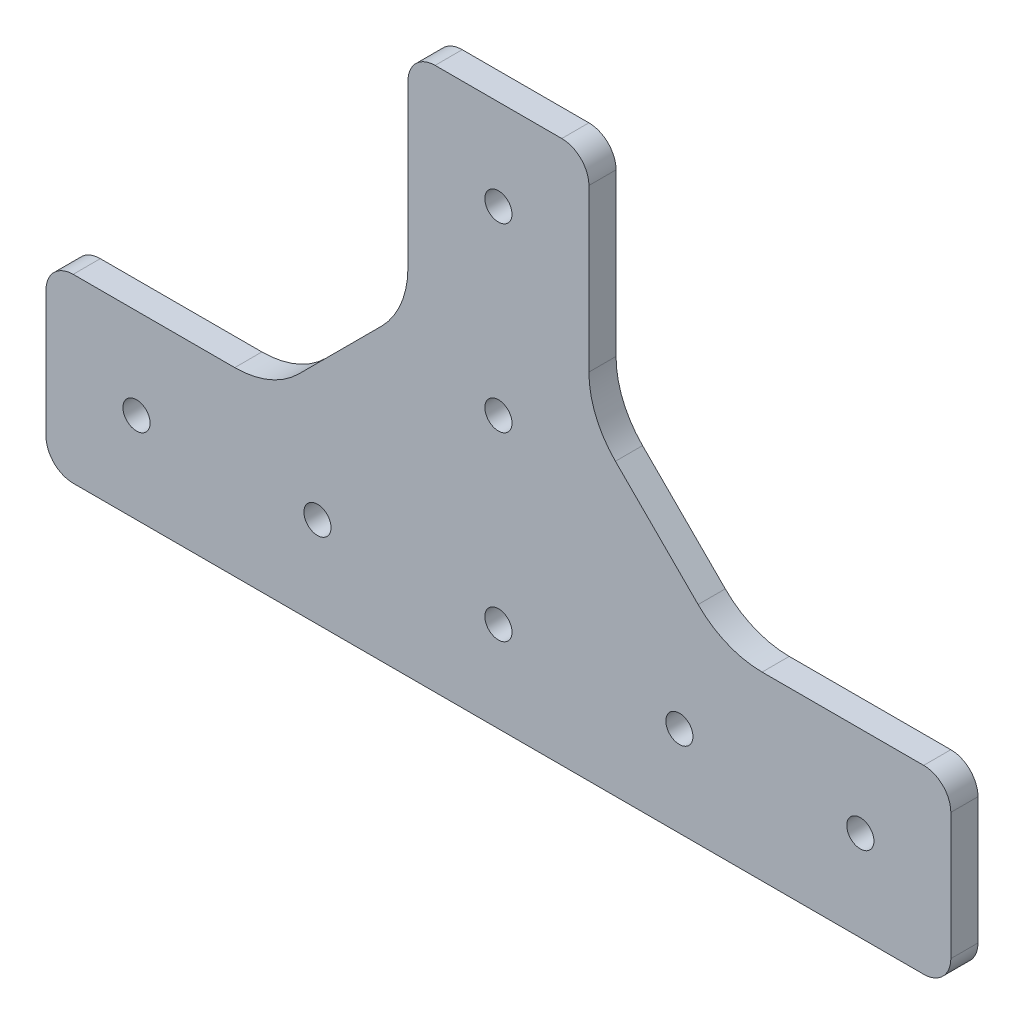
ISO-10303-21;
HEADER;
FILE_DESCRIPTION(('STEP AP214'),'2;1');
FILE_NAME('part.step','',(''),(''),'','','');
FILE_SCHEMA(('AUTOMOTIVE_DESIGN { 1 0 10303 214 1 1 1 1 }'));
ENDSEC;
DATA;
#1=APPLICATION_CONTEXT('core data for automotive mechanical design processes');
#2=APPLICATION_PROTOCOL_DEFINITION('international standard','automotive_design',2000,#1);
#3=PRODUCT_CONTEXT('',#1,'mechanical');
#4=PRODUCT('Part','Part','',(#3));
#5=PRODUCT_RELATED_PRODUCT_CATEGORY('part','',(#4));
#6=PRODUCT_DEFINITION_FORMATION('','',#4);
#7=PRODUCT_DEFINITION_CONTEXT('part definition',#1,'design');
#8=PRODUCT_DEFINITION('design','',#6,#7);
#9=PRODUCT_DEFINITION_SHAPE('','',#8);
#10=(LENGTH_UNIT() NAMED_UNIT(*) SI_UNIT(.MILLI.,.METRE.));
#11=(NAMED_UNIT(*) PLANE_ANGLE_UNIT() SI_UNIT($,.RADIAN.));
#12=(NAMED_UNIT(*) SI_UNIT($,.STERADIAN.) SOLID_ANGLE_UNIT());
#13=UNCERTAINTY_MEASURE_WITH_UNIT(LENGTH_MEASURE(1.E-05),#10,'distance_accuracy_value','');
#14=(GEOMETRIC_REPRESENTATION_CONTEXT(3) GLOBAL_UNCERTAINTY_ASSIGNED_CONTEXT((#13)) GLOBAL_UNIT_ASSIGNED_CONTEXT((#10,
#11,#12)) REPRESENTATION_CONTEXT('',''));
#15=CARTESIAN_POINT('',(0.,0.,0.));
#16=DIRECTION('',(0.,0.,1.));
#17=DIRECTION('',(1.,0.,0.));
#18=AXIS2_PLACEMENT_3D('',#15,#16,#17);
#19=CARTESIAN_POINT('',(0.,0.,3.));
#20=DIRECTION('',(1.,0.,0.));
#21=DIRECTION('',(0.,0.,-1.));
#22=AXIS2_PLACEMENT_3D('',#19,#20,#21);
#23=PLANE('',#22);
#24=DIRECTION('',(0.,-1.,0.));
#25=VECTOR('',#24,1.);
#26=CARTESIAN_POINT('',(0.,0.,0.));
#27=LINE('',#26,#25);
#28=CARTESIAN_POINT('',(0.,57.,0.));
#29=VERTEX_POINT('',#28);
#30=CARTESIAN_POINT('',(0.,39.1421356237311,0.));
#31=VERTEX_POINT('',#30);
#32=EDGE_CURVE('E313',#29,#31,#27,.T.);
#33=ORIENTED_EDGE('',*,*,#32,.T.);
#34=DIRECTION('',(0.,0.,1.));
#35=VECTOR('',#34,1.);
#36=CARTESIAN_POINT('',(0.,39.1421356237311,3.));
#37=LINE('',#36,#35);
#38=CARTESIAN_POINT('',(0.,39.1421356237311,3.));
#39=VERTEX_POINT('',#38);
#40=EDGE_CURVE('E288',#31,#39,#37,.T.);
#41=ORIENTED_EDGE('',*,*,#40,.T.);
#42=DIRECTION('',(0.,-1.,0.));
#43=VECTOR('',#42,1.);
#44=CARTESIAN_POINT('',(0.,0.,3.));
#45=LINE('',#44,#43);
#46=CARTESIAN_POINT('',(0.,57.,3.));
#47=VERTEX_POINT('',#46);
#48=EDGE_CURVE('E204',#47,#39,#45,.T.);
#49=ORIENTED_EDGE('',*,*,#48,.F.);
#50=DIRECTION('',(0.,0.,-1.));
#51=VECTOR('',#50,1.);
#52=CARTESIAN_POINT('',(0.,57.,3.));
#53=LINE('',#52,#51);
#54=EDGE_CURVE('E257',#47,#29,#53,.T.);
#55=ORIENTED_EDGE('',*,*,#54,.T.);
#56=EDGE_LOOP('',(#33,#41,#49,#55));
#57=FACE_BOUND('',#56,.T.);
#58=ADVANCED_FACE('F43',(#57),#23,.F.);
#59=CARTESIAN_POINT('',(0.,0.,3.));
#60=DIRECTION('',(0.,1.,0.));
#61=DIRECTION('',(0.,0.,1.));
#62=AXIS2_PLACEMENT_3D('',#59,#60,#61);
#63=PLANE('',#62);
#64=DIRECTION('',(1.,0.,0.));
#65=VECTOR('',#64,1.);
#66=CARTESIAN_POINT('',(0.,0.,0.));
#67=LINE('',#66,#65);
#68=CARTESIAN_POINT('',(-37.,0.,0.));
#69=VERTEX_POINT('',#68);
#70=CARTESIAN_POINT('',(57.,0.,0.));
#71=VERTEX_POINT('',#70);
#72=EDGE_CURVE('E210',#69,#71,#67,.T.);
#73=ORIENTED_EDGE('',*,*,#72,.T.);
#74=DIRECTION('',(0.,0.,1.));
#75=VECTOR('',#74,1.);
#76=CARTESIAN_POINT('',(57.,0.,3.));
#77=LINE('',#76,#75);
#78=CARTESIAN_POINT('',(57.,0.,3.));
#79=VERTEX_POINT('',#78);
#80=EDGE_CURVE('E246',#71,#79,#77,.T.);
#81=ORIENTED_EDGE('',*,*,#80,.T.);
#82=DIRECTION('',(1.,0.,0.));
#83=VECTOR('',#82,1.);
#84=CARTESIAN_POINT('',(0.,0.,3.));
#85=LINE('',#84,#83);
#86=CARTESIAN_POINT('',(-37.,0.,3.));
#87=VERTEX_POINT('',#86);
#88=EDGE_CURVE('E208',#87,#79,#85,.T.);
#89=ORIENTED_EDGE('',*,*,#88,.F.);
#90=DIRECTION('',(0.,0.,1.));
#91=VECTOR('',#90,1.);
#92=CARTESIAN_POINT('',(-37.,0.,0.));
#93=LINE('',#92,#91);
#94=EDGE_CURVE('E244',#87,#69,#93,.F.);
#95=ORIENTED_EDGE('',*,*,#94,.T.);
#96=EDGE_LOOP('',(#73,#81,#89,#95));
#97=FACE_BOUND('',#96,.T.);
#98=ADVANCED_FACE('F412',(#97),#63,.F.);
#99=CARTESIAN_POINT('',(20.,0.,3.));
#100=DIRECTION('',(-1.,0.,0.));
#101=DIRECTION('',(0.,0.,1.));
#102=AXIS2_PLACEMENT_3D('',#99,#100,#101);
#103=PLANE('',#102);
#104=DIRECTION('',(0.,1.,0.));
#105=VECTOR('',#104,1.);
#106=CARTESIAN_POINT('',(20.,0.,3.));
#107=LINE('',#106,#105);
#108=CARTESIAN_POINT('',(20.,39.142135623731,3.));
#109=VERTEX_POINT('',#108);
#110=CARTESIAN_POINT('',(20.,57.,3.));
#111=VERTEX_POINT('',#110);
#112=EDGE_CURVE('E322',#109,#111,#107,.T.);
#113=ORIENTED_EDGE('',*,*,#112,.F.);
#114=DIRECTION('',(0.,0.,-1.));
#115=VECTOR('',#114,1.);
#116=CARTESIAN_POINT('',(20.,39.142135623731,0.));
#117=LINE('',#116,#115);
#118=CARTESIAN_POINT('',(20.,39.142135623731,0.));
#119=VERTEX_POINT('',#118);
#120=EDGE_CURVE('E278',#109,#119,#117,.T.);
#121=ORIENTED_EDGE('',*,*,#120,.T.);
#122=DIRECTION('',(0.,1.,0.));
#123=VECTOR('',#122,1.);
#124=CARTESIAN_POINT('',(20.,0.,0.));
#125=LINE('',#124,#123);
#126=CARTESIAN_POINT('',(20.,57.,0.));
#127=VERTEX_POINT('',#126);
#128=EDGE_CURVE('E205',#119,#127,#125,.T.);
#129=ORIENTED_EDGE('',*,*,#128,.T.);
#130=DIRECTION('',(0.,0.,-1.));
#131=VECTOR('',#130,1.);
#132=CARTESIAN_POINT('',(20.,57.,3.));
#133=LINE('',#132,#131);
#134=EDGE_CURVE('E187',#127,#111,#133,.F.);
#135=ORIENTED_EDGE('',*,*,#134,.T.);
#136=EDGE_LOOP('',(#113,#121,#129,#135));
#137=FACE_BOUND('',#136,.T.);
#138=ADVANCED_FACE('F419',(#137),#103,.F.);
#139=CARTESIAN_POINT('',(0.,60.,3.));
#140=DIRECTION('',(0.,-1.,0.));
#141=DIRECTION('',(0.,0.,-1.));
#142=AXIS2_PLACEMENT_3D('',#139,#140,#141);
#143=PLANE('',#142);
#144=DIRECTION('',(-1.,0.,0.));
#145=VECTOR('',#144,1.);
#146=CARTESIAN_POINT('',(0.,60.,3.));
#147=LINE('',#146,#145);
#148=CARTESIAN_POINT('',(17.,60.,3.));
#149=VERTEX_POINT('',#148);
#150=CARTESIAN_POINT('',(3.,60.,3.));
#151=VERTEX_POINT('',#150);
#152=EDGE_CURVE('E199',#149,#151,#147,.T.);
#153=ORIENTED_EDGE('',*,*,#152,.F.);
#154=DIRECTION('',(0.,0.,-1.));
#155=VECTOR('',#154,1.);
#156=CARTESIAN_POINT('',(17.,60.,3.));
#157=LINE('',#156,#155);
#158=CARTESIAN_POINT('',(17.,60.,0.));
#159=VERTEX_POINT('',#158);
#160=EDGE_CURVE('E185',#149,#159,#157,.T.);
#161=ORIENTED_EDGE('',*,*,#160,.T.);
#162=DIRECTION('',(-1.,0.,0.));
#163=VECTOR('',#162,1.);
#164=CARTESIAN_POINT('',(0.,60.,0.));
#165=LINE('',#164,#163);
#166=CARTESIAN_POINT('',(3.,60.,0.));
#167=VERTEX_POINT('',#166);
#168=EDGE_CURVE('E196',#159,#167,#165,.T.);
#169=ORIENTED_EDGE('',*,*,#168,.T.);
#170=DIRECTION('',(0.,0.,-1.));
#171=VECTOR('',#170,1.);
#172=CARTESIAN_POINT('',(3.,60.,3.));
#173=LINE('',#172,#171);
#174=EDGE_CURVE('E201',#167,#151,#173,.F.);
#175=ORIENTED_EDGE('',*,*,#174,.T.);
#176=EDGE_LOOP('',(#153,#161,#169,#175));
#177=FACE_BOUND('',#176,.T.);
#178=ADVANCED_FACE('F195',(#177),#143,.F.);
#179=CARTESIAN_POINT('',(0.,0.,3.));
#180=DIRECTION('',(0.,0.,-1.));
#181=DIRECTION('',(-1.,0.,0.));
#182=AXIS2_PLACEMENT_3D('',#179,#180,#181);
#183=PLANE('',#182);
#184=CARTESIAN_POINT('',(50.,10.,3.));
#185=DIRECTION('',(0.,0.,1.));
#186=DIRECTION('',(1.,0.,0.));
#187=AXIS2_PLACEMENT_3D('',#184,#185,#186);
#188=CIRCLE('',#187,1.5);
#189=CARTESIAN_POINT('',(51.5,10.,3.));
#190=VERTEX_POINT('',#189);
#191=EDGE_CURVE('E353',#190,#190,#188,.T.);
#192=ORIENTED_EDGE('',*,*,#191,.F.);
#193=EDGE_LOOP('',(#192));
#194=FACE_BOUND('',#193,.T.);
#195=CARTESIAN_POINT('',(30.,10.,3.));
#196=DIRECTION('',(0.,0.,1.));
#197=DIRECTION('',(1.,0.,0.));
#198=AXIS2_PLACEMENT_3D('',#195,#196,#197);
#199=CIRCLE('',#198,1.50000000000001);
#200=CARTESIAN_POINT('',(31.5,10.,3.));
#201=VERTEX_POINT('',#200);
#202=EDGE_CURVE('E359',#201,#201,#199,.T.);
#203=ORIENTED_EDGE('',*,*,#202,.F.);
#204=EDGE_LOOP('',(#203));
#205=FACE_BOUND('',#204,.T.);
#206=CARTESIAN_POINT('',(-10.,10.,3.));
#207=DIRECTION('',(0.,0.,1.));
#208=DIRECTION('',(1.,0.,0.));
#209=AXIS2_PLACEMENT_3D('',#206,#207,#208);
#210=CIRCLE('',#209,1.5);
#211=CARTESIAN_POINT('',(-8.5,10.,3.));
#212=VERTEX_POINT('',#211);
#213=EDGE_CURVE('E365',#212,#212,#210,.T.);
#214=ORIENTED_EDGE('',*,*,#213,.F.);
#215=EDGE_LOOP('',(#214));
#216=FACE_BOUND('',#215,.T.);
#217=CARTESIAN_POINT('',(-30.,10.,3.));
#218=DIRECTION('',(0.,0.,1.));
#219=DIRECTION('',(1.,0.,0.));
#220=AXIS2_PLACEMENT_3D('',#217,#218,#219);
#221=CIRCLE('',#220,1.5);
#222=CARTESIAN_POINT('',(-28.5,10.,3.));
#223=VERTEX_POINT('',#222);
#224=EDGE_CURVE('E371',#223,#223,#221,.T.);
#225=ORIENTED_EDGE('',*,*,#224,.F.);
#226=EDGE_LOOP('',(#225));
#227=FACE_BOUND('',#226,.T.);
#228=CARTESIAN_POINT('',(10.,50.,3.));
#229=DIRECTION('',(0.,0.,1.));
#230=DIRECTION('',(1.,0.,0.));
#231=AXIS2_PLACEMENT_3D('',#228,#229,#230);
#232=CIRCLE('',#231,1.5);
#233=CARTESIAN_POINT('',(11.5,50.,3.));
#234=VERTEX_POINT('',#233);
#235=EDGE_CURVE('E377',#234,#234,#232,.T.);
#236=ORIENTED_EDGE('',*,*,#235,.F.);
#237=EDGE_LOOP('',(#236));
#238=FACE_BOUND('',#237,.T.);
#239=CARTESIAN_POINT('',(10.,30.,3.));
#240=DIRECTION('',(0.,0.,1.));
#241=DIRECTION('',(1.,0.,0.));
#242=AXIS2_PLACEMENT_3D('',#239,#240,#241);
#243=CIRCLE('',#242,1.5);
#244=CARTESIAN_POINT('',(11.5,30.,3.));
#245=VERTEX_POINT('',#244);
#246=EDGE_CURVE('E347',#245,#245,#243,.T.);
#247=ORIENTED_EDGE('',*,*,#246,.F.);
#248=EDGE_LOOP('',(#247));
#249=FACE_BOUND('',#248,.T.);
#250=CARTESIAN_POINT('',(10.,10.,3.));
#251=DIRECTION('',(0.,0.,1.));
#252=DIRECTION('',(1.,0.,0.));
#253=AXIS2_PLACEMENT_3D('',#250,#251,#252);
#254=CIRCLE('',#253,1.5);
#255=CARTESIAN_POINT('',(11.5,10.,3.));
#256=VERTEX_POINT('',#255);
#257=EDGE_CURVE('E344',#256,#256,#254,.T.);
#258=ORIENTED_EDGE('',*,*,#257,.F.);
#259=EDGE_LOOP('',(#258));
#260=FACE_BOUND('',#259,.T.);
#261=DIRECTION('',(-1.,0.,0.));
#262=VECTOR('',#261,1.);
#263=CARTESIAN_POINT('',(0.,20.,3.));
#264=LINE('',#263,#262);
#265=CARTESIAN_POINT('',(57.,20.,3.));
#266=VERTEX_POINT('',#265);
#267=CARTESIAN_POINT('',(39.1421356237309,20.,3.));
#268=VERTEX_POINT('',#267);
#269=EDGE_CURVE('E326',#266,#268,#264,.T.);
#270=ORIENTED_EDGE('',*,*,#269,.T.);
#271=CARTESIAN_POINT('',(39.1421356237309,30.,3.));
#272=DIRECTION('',(0.,0.,-1.));
#273=DIRECTION('',(-1.,0.,0.));
#274=AXIS2_PLACEMENT_3D('',#271,#272,#273);
#275=CIRCLE('',#274,10.);
#276=CARTESIAN_POINT('',(32.0710678118654,22.9289321881346,3.));
#277=VERTEX_POINT('',#276);
#278=EDGE_CURVE('E290',#268,#277,#275,.T.);
#279=ORIENTED_EDGE('',*,*,#278,.T.);
#280=DIRECTION('',(-0.707106781186544,0.707106781186551,0.));
#281=VECTOR('',#280,1.);
#282=CARTESIAN_POINT('',(27.5000000000002,27.4999999999999,3.));
#283=LINE('',#282,#281);
#284=CARTESIAN_POINT('',(22.9289321881345,32.0710678118656,3.));
#285=VERTEX_POINT('',#284);
#286=EDGE_CURVE('E263',#277,#285,#283,.T.);
#287=ORIENTED_EDGE('',*,*,#286,.T.);
#288=CARTESIAN_POINT('',(30.,39.142135623731,3.));
#289=DIRECTION('',(0.,0.,-1.));
#290=DIRECTION('',(-1.,0.,0.));
#291=AXIS2_PLACEMENT_3D('',#288,#289,#290);
#292=CIRCLE('',#291,10.);
#293=EDGE_CURVE('E296',#285,#109,#292,.T.);
#294=ORIENTED_EDGE('',*,*,#293,.T.);
#295=ORIENTED_EDGE('',*,*,#112,.T.);
#296=CARTESIAN_POINT('',(17.,57.,3.));
#297=DIRECTION('',(0.,0.,-1.));
#298=DIRECTION('',(-1.,0.,0.));
#299=AXIS2_PLACEMENT_3D('',#296,#297,#298);
#300=CIRCLE('',#299,3.);
#301=EDGE_CURVE('E235',#111,#149,#300,.F.);
#302=ORIENTED_EDGE('',*,*,#301,.T.);
#303=ORIENTED_EDGE('',*,*,#152,.T.);
#304=CARTESIAN_POINT('',(3.,57.,3.));
#305=DIRECTION('',(0.,0.,-1.));
#306=DIRECTION('',(-1.,0.,0.));
#307=AXIS2_PLACEMENT_3D('',#304,#305,#306);
#308=CIRCLE('',#307,3.);
#309=EDGE_CURVE('E225',#151,#47,#308,.F.);
#310=ORIENTED_EDGE('',*,*,#309,.T.);
#311=ORIENTED_EDGE('',*,*,#48,.T.);
#312=CARTESIAN_POINT('',(-10.,39.1421356237311,3.));
#313=DIRECTION('',(0.,0.,-1.));
#314=DIRECTION('',(-1.,0.,0.));
#315=AXIS2_PLACEMENT_3D('',#312,#313,#314);
#316=CIRCLE('',#315,10.);
#317=CARTESIAN_POINT('',(-2.92893218813448,32.0710678118656,3.));
#318=VERTEX_POINT('',#317);
#319=EDGE_CURVE('E51',#39,#318,#316,.T.);
#320=ORIENTED_EDGE('',*,*,#319,.T.);
#321=DIRECTION('',(-0.707106781186543,-0.707106781186552,0.));
#322=VECTOR('',#321,1.);
#323=CARTESIAN_POINT('',(-17.5000000000001,17.4999999999999,3.));
#324=LINE('',#323,#322);
#325=CARTESIAN_POINT('',(-12.0710678118654,22.9289321881346,3.));
#326=VERTEX_POINT('',#325);
#327=EDGE_CURVE('E266',#318,#326,#324,.T.);
#328=ORIENTED_EDGE('',*,*,#327,.T.);
#329=CARTESIAN_POINT('',(-19.1421356237309,30.,3.));
#330=DIRECTION('',(0.,0.,-1.));
#331=DIRECTION('',(-1.,0.,0.));
#332=AXIS2_PLACEMENT_3D('',#329,#330,#331);
#333=CIRCLE('',#332,10.);
#334=CARTESIAN_POINT('',(-19.1421356237309,20.,3.));
#335=VERTEX_POINT('',#334);
#336=EDGE_CURVE('E300',#326,#335,#333,.T.);
#337=ORIENTED_EDGE('',*,*,#336,.T.);
#338=DIRECTION('',(-1.,0.,0.));
#339=VECTOR('',#338,1.);
#340=CARTESIAN_POINT('',(20.,20.,3.));
#341=LINE('',#340,#339);
#342=CARTESIAN_POINT('',(-37.,20.,3.));
#343=VERTEX_POINT('',#342);
#344=EDGE_CURVE('E338',#335,#343,#341,.T.);
#345=ORIENTED_EDGE('',*,*,#344,.T.);
#346=CARTESIAN_POINT('',(-37.,17.,3.));
#347=DIRECTION('',(0.,0.,-1.));
#348=DIRECTION('',(-1.,0.,0.));
#349=AXIS2_PLACEMENT_3D('',#346,#347,#348);
#350=CIRCLE('',#349,3.);
#351=CARTESIAN_POINT('',(-40.,17.,3.));
#352=VERTEX_POINT('',#351);
#353=EDGE_CURVE('E227',#343,#352,#350,.F.);
#354=ORIENTED_EDGE('',*,*,#353,.T.);
#355=DIRECTION('',(0.,-1.,0.));
#356=VECTOR('',#355,1.);
#357=CARTESIAN_POINT('',(-40.,20.,3.));
#358=LINE('',#357,#356);
#359=CARTESIAN_POINT('',(-40.,3.,3.));
#360=VERTEX_POINT('',#359);
#361=EDGE_CURVE('E334',#352,#360,#358,.T.);
#362=ORIENTED_EDGE('',*,*,#361,.T.);
#363=CARTESIAN_POINT('',(-37.,3.,3.));
#364=DIRECTION('',(0.,0.,-1.));
#365=DIRECTION('',(-1.,0.,0.));
#366=AXIS2_PLACEMENT_3D('',#363,#364,#365);
#367=CIRCLE('',#366,3.);
#368=EDGE_CURVE('E229',#360,#87,#367,.F.);
#369=ORIENTED_EDGE('',*,*,#368,.T.);
#370=ORIENTED_EDGE('',*,*,#88,.T.);
#371=CARTESIAN_POINT('',(57.,3.,3.));
#372=DIRECTION('',(0.,0.,-1.));
#373=DIRECTION('',(-1.,0.,0.));
#374=AXIS2_PLACEMENT_3D('',#371,#372,#373);
#375=CIRCLE('',#374,3.);
#376=CARTESIAN_POINT('',(60.,3.,3.));
#377=VERTEX_POINT('',#376);
#378=EDGE_CURVE('E231',#79,#377,#375,.F.);
#379=ORIENTED_EDGE('',*,*,#378,.T.);
#380=DIRECTION('',(0.,1.,0.));
#381=VECTOR('',#380,1.);
#382=CARTESIAN_POINT('',(60.,0.,3.));
#383=LINE('',#382,#381);
#384=CARTESIAN_POINT('',(60.,17.,3.));
#385=VERTEX_POINT('',#384);
#386=EDGE_CURVE('E328',#377,#385,#383,.T.);
#387=ORIENTED_EDGE('',*,*,#386,.T.);
#388=CARTESIAN_POINT('',(57.,17.,3.));
#389=DIRECTION('',(0.,0.,-1.));
#390=DIRECTION('',(-1.,0.,0.));
#391=AXIS2_PLACEMENT_3D('',#388,#389,#390);
#392=CIRCLE('',#391,3.);
#393=EDGE_CURVE('E233',#385,#266,#392,.F.);
#394=ORIENTED_EDGE('',*,*,#393,.T.);
#395=EDGE_LOOP('',(#270,#279,#287,#294,#295,#302,#303,#310,#311,#320,#328,#337,#345,#354,#362,
#369,#370,#379,#387,#394));
#396=FACE_BOUND('',#395,.T.);
#397=ADVANCED_FACE('F304',(#194,#205,#216,#227,#238,#249,#260,#396),#183,.F.);
#398=CARTESIAN_POINT('',(0.,0.,0.));
#399=DIRECTION('',(0.,0.,-1.));
#400=DIRECTION('',(-1.,0.,0.));
#401=AXIS2_PLACEMENT_3D('',#398,#399,#400);
#402=PLANE('',#401);
#403=CARTESIAN_POINT('',(50.,10.,0.));
#404=DIRECTION('',(0.,0.,1.));
#405=DIRECTION('',(1.,0.,0.));
#406=AXIS2_PLACEMENT_3D('',#403,#404,#405);
#407=CIRCLE('',#406,1.5);
#408=CARTESIAN_POINT('',(51.5,10.,0.));
#409=VERTEX_POINT('',#408);
#410=EDGE_CURVE('E350',#409,#409,#407,.T.);
#411=ORIENTED_EDGE('',*,*,#410,.T.);
#412=EDGE_LOOP('',(#411));
#413=FACE_BOUND('',#412,.T.);
#414=CARTESIAN_POINT('',(30.,10.,0.));
#415=DIRECTION('',(0.,0.,1.));
#416=DIRECTION('',(1.,0.,0.));
#417=AXIS2_PLACEMENT_3D('',#414,#415,#416);
#418=CIRCLE('',#417,1.50000000000001);
#419=CARTESIAN_POINT('',(31.5,10.,0.));
#420=VERTEX_POINT('',#419);
#421=EDGE_CURVE('E356',#420,#420,#418,.T.);
#422=ORIENTED_EDGE('',*,*,#421,.T.);
#423=EDGE_LOOP('',(#422));
#424=FACE_BOUND('',#423,.T.);
#425=CARTESIAN_POINT('',(-10.,10.,0.));
#426=DIRECTION('',(0.,0.,1.));
#427=DIRECTION('',(1.,0.,0.));
#428=AXIS2_PLACEMENT_3D('',#425,#426,#427);
#429=CIRCLE('',#428,1.5);
#430=CARTESIAN_POINT('',(-8.5,10.,0.));
#431=VERTEX_POINT('',#430);
#432=EDGE_CURVE('E362',#431,#431,#429,.T.);
#433=ORIENTED_EDGE('',*,*,#432,.T.);
#434=EDGE_LOOP('',(#433));
#435=FACE_BOUND('',#434,.T.);
#436=CARTESIAN_POINT('',(-30.,10.,0.));
#437=DIRECTION('',(0.,0.,1.));
#438=DIRECTION('',(1.,0.,0.));
#439=AXIS2_PLACEMENT_3D('',#436,#437,#438);
#440=CIRCLE('',#439,1.5);
#441=CARTESIAN_POINT('',(-28.5,10.,0.));
#442=VERTEX_POINT('',#441);
#443=EDGE_CURVE('E368',#442,#442,#440,.T.);
#444=ORIENTED_EDGE('',*,*,#443,.T.);
#445=EDGE_LOOP('',(#444));
#446=FACE_BOUND('',#445,.T.);
#447=CARTESIAN_POINT('',(10.,50.,0.));
#448=DIRECTION('',(0.,0.,1.));
#449=DIRECTION('',(1.,0.,0.));
#450=AXIS2_PLACEMENT_3D('',#447,#448,#449);
#451=CIRCLE('',#450,1.5);
#452=CARTESIAN_POINT('',(11.5,50.,0.));
#453=VERTEX_POINT('',#452);
#454=EDGE_CURVE('E374',#453,#453,#451,.T.);
#455=ORIENTED_EDGE('',*,*,#454,.T.);
#456=EDGE_LOOP('',(#455));
#457=FACE_BOUND('',#456,.T.);
#458=CARTESIAN_POINT('',(10.,30.,0.));
#459=DIRECTION('',(0.,0.,1.));
#460=DIRECTION('',(1.,0.,0.));
#461=AXIS2_PLACEMENT_3D('',#458,#459,#460);
#462=CIRCLE('',#461,1.5);
#463=CARTESIAN_POINT('',(11.5,30.,0.));
#464=VERTEX_POINT('',#463);
#465=EDGE_CURVE('E380',#464,#464,#462,.T.);
#466=ORIENTED_EDGE('',*,*,#465,.T.);
#467=EDGE_LOOP('',(#466));
#468=FACE_BOUND('',#467,.T.);
#469=CARTESIAN_POINT('',(10.,10.,0.));
#470=DIRECTION('',(0.,0.,1.));
#471=DIRECTION('',(1.,0.,0.));
#472=AXIS2_PLACEMENT_3D('',#469,#470,#471);
#473=CIRCLE('',#472,1.5);
#474=CARTESIAN_POINT('',(11.5,10.,0.));
#475=VERTEX_POINT('',#474);
#476=EDGE_CURVE('E340',#475,#475,#473,.T.);
#477=ORIENTED_EDGE('',*,*,#476,.T.);
#478=EDGE_LOOP('',(#477));
#479=FACE_BOUND('',#478,.T.);
#480=ORIENTED_EDGE('',*,*,#168,.F.);
#481=CARTESIAN_POINT('',(17.,57.,0.));
#482=DIRECTION('',(0.,0.,-1.));
#483=DIRECTION('',(-1.,0.,0.));
#484=AXIS2_PLACEMENT_3D('',#481,#482,#483);
#485=CIRCLE('',#484,3.);
#486=EDGE_CURVE('E181',#159,#127,#485,.T.);
#487=ORIENTED_EDGE('',*,*,#486,.T.);
#488=ORIENTED_EDGE('',*,*,#128,.F.);
#489=CARTESIAN_POINT('',(30.,39.142135623731,0.));
#490=DIRECTION('',(0.,0.,-1.));
#491=DIRECTION('',(-1.,0.,0.));
#492=AXIS2_PLACEMENT_3D('',#489,#490,#491);
#493=CIRCLE('',#492,10.);
#494=CARTESIAN_POINT('',(22.9289321881345,32.0710678118656,0.));
#495=VERTEX_POINT('',#494);
#496=EDGE_CURVE('E294',#119,#495,#493,.F.);
#497=ORIENTED_EDGE('',*,*,#496,.T.);
#498=DIRECTION('',(0.707106781186544,-0.707106781186551,0.));
#499=VECTOR('',#498,1.);
#500=CARTESIAN_POINT('',(20.,35.0000000000001,0.));
#501=LINE('',#500,#499);
#502=CARTESIAN_POINT('',(32.0710678118654,22.9289321881346,0.));
#503=VERTEX_POINT('',#502);
#504=EDGE_CURVE('E260',#495,#503,#501,.T.);
#505=ORIENTED_EDGE('',*,*,#504,.T.);
#506=CARTESIAN_POINT('',(39.1421356237309,30.,0.));
#507=DIRECTION('',(0.,0.,-1.));
#508=DIRECTION('',(-1.,0.,0.));
#509=AXIS2_PLACEMENT_3D('',#506,#507,#508);
#510=CIRCLE('',#509,10.);
#511=CARTESIAN_POINT('',(39.1421356237309,20.,0.));
#512=VERTEX_POINT('',#511);
#513=EDGE_CURVE('E292',#503,#512,#510,.F.);
#514=ORIENTED_EDGE('',*,*,#513,.T.);
#515=DIRECTION('',(-1.,0.,0.));
#516=VECTOR('',#515,1.);
#517=CARTESIAN_POINT('',(0.,20.,0.));
#518=LINE('',#517,#516);
#519=CARTESIAN_POINT('',(57.,20.,0.));
#520=VERTEX_POINT('',#519);
#521=EDGE_CURVE('E314',#520,#512,#518,.T.);
#522=ORIENTED_EDGE('',*,*,#521,.F.);
#523=CARTESIAN_POINT('',(57.,17.,0.));
#524=DIRECTION('',(0.,0.,-1.));
#525=DIRECTION('',(-1.,0.,0.));
#526=AXIS2_PLACEMENT_3D('',#523,#524,#525);
#527=CIRCLE('',#526,3.);
#528=CARTESIAN_POINT('',(60.,17.,0.));
#529=VERTEX_POINT('',#528);
#530=EDGE_CURVE('E190',#520,#529,#527,.T.);
#531=ORIENTED_EDGE('',*,*,#530,.T.);
#532=DIRECTION('',(0.,1.,0.));
#533=VECTOR('',#532,1.);
#534=CARTESIAN_POINT('',(60.,0.,0.));
#535=LINE('',#534,#533);
#536=CARTESIAN_POINT('',(60.,3.,0.));
#537=VERTEX_POINT('',#536);
#538=EDGE_CURVE('E318',#537,#529,#535,.T.);
#539=ORIENTED_EDGE('',*,*,#538,.F.);
#540=CARTESIAN_POINT('',(57.,3.,0.));
#541=DIRECTION('',(0.,0.,-1.));
#542=DIRECTION('',(-1.,0.,0.));
#543=AXIS2_PLACEMENT_3D('',#540,#541,#542);
#544=CIRCLE('',#543,3.);
#545=EDGE_CURVE('E221',#537,#71,#544,.T.);
#546=ORIENTED_EDGE('',*,*,#545,.T.);
#547=ORIENTED_EDGE('',*,*,#72,.F.);
#548=CARTESIAN_POINT('',(-37.,3.,0.));
#549=DIRECTION('',(0.,0.,-1.));
#550=DIRECTION('',(-1.,0.,0.));
#551=AXIS2_PLACEMENT_3D('',#548,#549,#550);
#552=CIRCLE('',#551,3.);
#553=CARTESIAN_POINT('',(-40.,3.,0.));
#554=VERTEX_POINT('',#553);
#555=EDGE_CURVE('E219',#69,#554,#552,.T.);
#556=ORIENTED_EDGE('',*,*,#555,.T.);
#557=DIRECTION('',(0.,-1.,0.));
#558=VECTOR('',#557,1.);
#559=CARTESIAN_POINT('',(-40.,20.,0.));
#560=LINE('',#559,#558);
#561=CARTESIAN_POINT('',(-40.,17.,0.));
#562=VERTEX_POINT('',#561);
#563=EDGE_CURVE('E330',#562,#554,#560,.T.);
#564=ORIENTED_EDGE('',*,*,#563,.F.);
#565=CARTESIAN_POINT('',(-37.,17.,0.));
#566=DIRECTION('',(0.,0.,-1.));
#567=DIRECTION('',(-1.,0.,0.));
#568=AXIS2_PLACEMENT_3D('',#565,#566,#567);
#569=CIRCLE('',#568,3.);
#570=CARTESIAN_POINT('',(-37.,20.,0.));
#571=VERTEX_POINT('',#570);
#572=EDGE_CURVE('E216',#562,#571,#569,.T.);
#573=ORIENTED_EDGE('',*,*,#572,.T.);
#574=DIRECTION('',(-1.,0.,0.));
#575=VECTOR('',#574,1.);
#576=CARTESIAN_POINT('',(20.,20.,0.));
#577=LINE('',#576,#575);
#578=CARTESIAN_POINT('',(-19.1421356237309,20.,0.));
#579=VERTEX_POINT('',#578);
#580=EDGE_CURVE('E337',#579,#571,#577,.T.);
#581=ORIENTED_EDGE('',*,*,#580,.F.);
#582=CARTESIAN_POINT('',(-19.1421356237309,30.,0.));
#583=DIRECTION('',(0.,0.,-1.));
#584=DIRECTION('',(-1.,0.,0.));
#585=AXIS2_PLACEMENT_3D('',#582,#583,#584);
#586=CIRCLE('',#585,10.);
#587=CARTESIAN_POINT('',(-12.0710678118654,22.9289321881346,0.));
#588=VERTEX_POINT('',#587);
#589=EDGE_CURVE('E298',#579,#588,#586,.F.);
#590=ORIENTED_EDGE('',*,*,#589,.T.);
#591=DIRECTION('',(0.707106781186543,0.707106781186552,0.));
#592=VECTOR('',#591,1.);
#593=CARTESIAN_POINT('',(0.,35.0000000000001,0.));
#594=LINE('',#593,#592);
#595=CARTESIAN_POINT('',(-2.92893218813448,32.0710678118656,0.));
#596=VERTEX_POINT('',#595);
#597=EDGE_CURVE('E269',#588,#596,#594,.T.);
#598=ORIENTED_EDGE('',*,*,#597,.T.);
#599=CARTESIAN_POINT('',(-10.,39.1421356237311,0.));
#600=DIRECTION('',(0.,0.,-1.));
#601=DIRECTION('',(-1.,0.,0.));
#602=AXIS2_PLACEMENT_3D('',#599,#600,#601);
#603=CIRCLE('',#602,10.);
#604=EDGE_CURVE('E11',#596,#31,#603,.F.);
#605=ORIENTED_EDGE('',*,*,#604,.T.);
#606=ORIENTED_EDGE('',*,*,#32,.F.);
#607=CARTESIAN_POINT('',(3.,57.,0.));
#608=DIRECTION('',(0.,0.,-1.));
#609=DIRECTION('',(-1.,0.,0.));
#610=AXIS2_PLACEMENT_3D('',#607,#608,#609);
#611=CIRCLE('',#610,3.);
#612=EDGE_CURVE('E200',#29,#167,#611,.T.);
#613=ORIENTED_EDGE('',*,*,#612,.T.);
#614=EDGE_LOOP('',(#480,#487,#488,#497,#505,#514,#522,#531,#539,#546,#547,#556,#564,#573,#581,
#590,#598,#605,#606,#613));
#615=FACE_BOUND('',#614,.T.);
#616=ADVANCED_FACE('F203',(#413,#424,#435,#446,#457,#468,#479,#615),#402,.T.);
#617=CARTESIAN_POINT('',(0.,20.,0.));
#618=DIRECTION('',(0.,1.,0.));
#619=DIRECTION('',(0.,0.,1.));
#620=AXIS2_PLACEMENT_3D('',#617,#618,#619);
#621=PLANE('',#620);
#622=ORIENTED_EDGE('',*,*,#521,.T.);
#623=DIRECTION('',(0.,0.,1.));
#624=VECTOR('',#623,1.);
#625=CARTESIAN_POINT('',(39.1421356237309,20.,0.));
#626=LINE('',#625,#624);
#627=EDGE_CURVE('E271',#512,#268,#626,.T.);
#628=ORIENTED_EDGE('',*,*,#627,.T.);
#629=ORIENTED_EDGE('',*,*,#269,.F.);
#630=DIRECTION('',(0.,0.,1.));
#631=VECTOR('',#630,1.);
#632=CARTESIAN_POINT('',(57.,20.,0.));
#633=LINE('',#632,#631);
#634=EDGE_CURVE('E242',#266,#520,#633,.F.);
#635=ORIENTED_EDGE('',*,*,#634,.T.);
#636=EDGE_LOOP('',(#622,#628,#629,#635));
#637=FACE_BOUND('',#636,.T.);
#638=ADVANCED_FACE('F498',(#637),#621,.T.);
#639=CARTESIAN_POINT('',(60.,0.,0.));
#640=DIRECTION('',(1.,0.,0.));
#641=DIRECTION('',(0.,0.,-1.));
#642=AXIS2_PLACEMENT_3D('',#639,#640,#641);
#643=PLANE('',#642);
#644=ORIENTED_EDGE('',*,*,#538,.T.);
#645=DIRECTION('',(0.,0.,1.));
#646=VECTOR('',#645,1.);
#647=CARTESIAN_POINT('',(60.,17.,0.));
#648=LINE('',#647,#646);
#649=EDGE_CURVE('E239',#529,#385,#648,.T.);
#650=ORIENTED_EDGE('',*,*,#649,.T.);
#651=ORIENTED_EDGE('',*,*,#386,.F.);
#652=DIRECTION('',(0.,0.,1.));
#653=VECTOR('',#652,1.);
#654=CARTESIAN_POINT('',(60.,3.,0.));
#655=LINE('',#654,#653);
#656=EDGE_CURVE('E237',#377,#537,#655,.F.);
#657=ORIENTED_EDGE('',*,*,#656,.T.);
#658=EDGE_LOOP('',(#644,#650,#651,#657));
#659=FACE_BOUND('',#658,.T.);
#660=ADVANCED_FACE('F491',(#659),#643,.T.);
#661=CARTESIAN_POINT('',(20.,20.,0.));
#662=DIRECTION('',(0.,1.,0.));
#663=DIRECTION('',(-1.,0.,0.));
#664=AXIS2_PLACEMENT_3D('',#661,#662,#663);
#665=PLANE('',#664);
#666=ORIENTED_EDGE('',*,*,#344,.F.);
#667=DIRECTION('',(0.,0.,-1.));
#668=VECTOR('',#667,1.);
#669=CARTESIAN_POINT('',(-19.1421356237309,20.,0.));
#670=LINE('',#669,#668);
#671=EDGE_CURVE('E281',#335,#579,#670,.T.);
#672=ORIENTED_EDGE('',*,*,#671,.T.);
#673=ORIENTED_EDGE('',*,*,#580,.T.);
#674=DIRECTION('',(0.,0.,1.));
#675=VECTOR('',#674,1.);
#676=CARTESIAN_POINT('',(-37.,20.,0.));
#677=LINE('',#676,#675);
#678=EDGE_CURVE('E254',#571,#343,#677,.T.);
#679=ORIENTED_EDGE('',*,*,#678,.T.);
#680=EDGE_LOOP('',(#666,#672,#673,#679));
#681=FACE_BOUND('',#680,.T.);
#682=ADVANCED_FACE('F406',(#681),#665,.T.);
#683=CARTESIAN_POINT('',(-40.,20.,0.));
#684=DIRECTION('',(-1.,0.,0.));
#685=DIRECTION('',(0.,0.,1.));
#686=AXIS2_PLACEMENT_3D('',#683,#684,#685);
#687=PLANE('',#686);
#688=ORIENTED_EDGE('',*,*,#563,.T.);
#689=DIRECTION('',(0.,0.,1.));
#690=VECTOR('',#689,1.);
#691=CARTESIAN_POINT('',(-40.,3.,3.));
#692=LINE('',#691,#690);
#693=EDGE_CURVE('E251',#554,#360,#692,.T.);
#694=ORIENTED_EDGE('',*,*,#693,.T.);
#695=ORIENTED_EDGE('',*,*,#361,.F.);
#696=DIRECTION('',(0.,0.,1.));
#697=VECTOR('',#696,1.);
#698=CARTESIAN_POINT('',(-40.,17.,0.));
#699=LINE('',#698,#697);
#700=EDGE_CURVE('E249',#352,#562,#699,.F.);
#701=ORIENTED_EDGE('',*,*,#700,.T.);
#702=EDGE_LOOP('',(#688,#694,#695,#701));
#703=FACE_BOUND('',#702,.T.);
#704=ADVANCED_FACE('F396',(#703),#687,.T.);
#705=CARTESIAN_POINT('',(10.,10.,0.));
#706=DIRECTION('',(0.,0.,1.));
#707=DIRECTION('',(1.,0.,0.));
#708=AXIS2_PLACEMENT_3D('',#705,#706,#707);
#709=CYLINDRICAL_SURFACE('',#708,1.5);
#710=ORIENTED_EDGE('',*,*,#476,.F.);
#711=EDGE_LOOP('',(#710));
#712=FACE_BOUND('',#711,.T.);
#713=ORIENTED_EDGE('',*,*,#257,.T.);
#714=EDGE_LOOP('',(#713));
#715=FACE_BOUND('',#714,.T.);
#716=ADVANCED_FACE('F394',(#712,#715),#709,.F.);
#717=CARTESIAN_POINT('',(10.,30.,0.));
#718=DIRECTION('',(0.,0.,1.));
#719=DIRECTION('',(1.,0.,0.));
#720=AXIS2_PLACEMENT_3D('',#717,#718,#719);
#721=CYLINDRICAL_SURFACE('',#720,1.5);
#722=ORIENTED_EDGE('',*,*,#465,.F.);
#723=EDGE_LOOP('',(#722));
#724=FACE_BOUND('',#723,.T.);
#725=ORIENTED_EDGE('',*,*,#246,.T.);
#726=EDGE_LOOP('',(#725));
#727=FACE_BOUND('',#726,.T.);
#728=ADVANCED_FACE('F386',(#724,#727),#721,.F.);
#729=CARTESIAN_POINT('',(10.,50.,0.));
#730=DIRECTION('',(0.,0.,1.));
#731=DIRECTION('',(1.,0.,0.));
#732=AXIS2_PLACEMENT_3D('',#729,#730,#731);
#733=CYLINDRICAL_SURFACE('',#732,1.5);
#734=ORIENTED_EDGE('',*,*,#454,.F.);
#735=EDGE_LOOP('',(#734));
#736=FACE_BOUND('',#735,.T.);
#737=ORIENTED_EDGE('',*,*,#235,.T.);
#738=EDGE_LOOP('',(#737));
#739=FACE_BOUND('',#738,.T.);
#740=ADVANCED_FACE('F402',(#736,#739),#733,.F.);
#741=CARTESIAN_POINT('',(-30.,10.,0.));
#742=DIRECTION('',(0.,0.,1.));
#743=DIRECTION('',(1.,0.,0.));
#744=AXIS2_PLACEMENT_3D('',#741,#742,#743);
#745=CYLINDRICAL_SURFACE('',#744,1.5);
#746=ORIENTED_EDGE('',*,*,#443,.F.);
#747=EDGE_LOOP('',(#746));
#748=FACE_BOUND('',#747,.T.);
#749=ORIENTED_EDGE('',*,*,#224,.T.);
#750=EDGE_LOOP('',(#749));
#751=FACE_BOUND('',#750,.T.);
#752=ADVANCED_FACE('F619',(#748,#751),#745,.F.);
#753=CARTESIAN_POINT('',(-10.,10.,0.));
#754=DIRECTION('',(0.,0.,1.));
#755=DIRECTION('',(1.,0.,0.));
#756=AXIS2_PLACEMENT_3D('',#753,#754,#755);
#757=CYLINDRICAL_SURFACE('',#756,1.5);
#758=ORIENTED_EDGE('',*,*,#432,.F.);
#759=EDGE_LOOP('',(#758));
#760=FACE_BOUND('',#759,.T.);
#761=ORIENTED_EDGE('',*,*,#213,.T.);
#762=EDGE_LOOP('',(#761));
#763=FACE_BOUND('',#762,.T.);
#764=ADVANCED_FACE('F610',(#760,#763),#757,.F.);
#765=CARTESIAN_POINT('',(30.,10.,0.));
#766=DIRECTION('',(0.,0.,1.));
#767=DIRECTION('',(1.,0.,0.));
#768=AXIS2_PLACEMENT_3D('',#765,#766,#767);
#769=CYLINDRICAL_SURFACE('',#768,1.50000000000001);
#770=ORIENTED_EDGE('',*,*,#421,.F.);
#771=EDGE_LOOP('',(#770));
#772=FACE_BOUND('',#771,.T.);
#773=ORIENTED_EDGE('',*,*,#202,.T.);
#774=EDGE_LOOP('',(#773));
#775=FACE_BOUND('',#774,.T.);
#776=ADVANCED_FACE('F602',(#772,#775),#769,.F.);
#777=CARTESIAN_POINT('',(50.,10.,0.));
#778=DIRECTION('',(0.,0.,1.));
#779=DIRECTION('',(1.,0.,0.));
#780=AXIS2_PLACEMENT_3D('',#777,#778,#779);
#781=CYLINDRICAL_SURFACE('',#780,1.5);
#782=ORIENTED_EDGE('',*,*,#410,.F.);
#783=EDGE_LOOP('',(#782));
#784=FACE_BOUND('',#783,.T.);
#785=ORIENTED_EDGE('',*,*,#191,.T.);
#786=EDGE_LOOP('',(#785));
#787=FACE_BOUND('',#786,.T.);
#788=ADVANCED_FACE('F427',(#784,#787),#781,.F.);
#789=CARTESIAN_POINT('',(17.,57.,3.));
#790=DIRECTION('',(0.,0.,-1.));
#791=DIRECTION('',(-1.,0.,0.));
#792=AXIS2_PLACEMENT_3D('',#789,#790,#791);
#793=CYLINDRICAL_SURFACE('',#792,3.);
#794=ORIENTED_EDGE('',*,*,#301,.F.);
#795=ORIENTED_EDGE('',*,*,#134,.F.);
#796=ORIENTED_EDGE('',*,*,#486,.F.);
#797=ORIENTED_EDGE('',*,*,#160,.F.);
#798=EDGE_LOOP('',(#794,#795,#796,#797));
#799=FACE_BOUND('',#798,.T.);
#800=ADVANCED_FACE('F184',(#799),#793,.T.);
#801=CARTESIAN_POINT('',(57.,17.,0.));
#802=DIRECTION('',(0.,0.,1.));
#803=DIRECTION('',(1.,0.,0.));
#804=AXIS2_PLACEMENT_3D('',#801,#802,#803);
#805=CYLINDRICAL_SURFACE('',#804,3.);
#806=ORIENTED_EDGE('',*,*,#530,.F.);
#807=ORIENTED_EDGE('',*,*,#634,.F.);
#808=ORIENTED_EDGE('',*,*,#393,.F.);
#809=ORIENTED_EDGE('',*,*,#649,.F.);
#810=EDGE_LOOP('',(#806,#807,#808,#809));
#811=FACE_BOUND('',#810,.T.);
#812=ADVANCED_FACE('F426',(#811),#805,.T.);
#813=CARTESIAN_POINT('',(57.,3.,3.));
#814=DIRECTION('',(0.,0.,-1.));
#815=DIRECTION('',(-1.,0.,0.));
#816=AXIS2_PLACEMENT_3D('',#813,#814,#815);
#817=CYLINDRICAL_SURFACE('',#816,3.);
#818=ORIENTED_EDGE('',*,*,#545,.F.);
#819=ORIENTED_EDGE('',*,*,#656,.F.);
#820=ORIENTED_EDGE('',*,*,#378,.F.);
#821=ORIENTED_EDGE('',*,*,#80,.F.);
#822=EDGE_LOOP('',(#818,#819,#820,#821));
#823=FACE_BOUND('',#822,.T.);
#824=ADVANCED_FACE('F430',(#823),#817,.T.);
#825=CARTESIAN_POINT('',(-37.,3.,0.));
#826=DIRECTION('',(0.,0.,-1.));
#827=DIRECTION('',(-1.,0.,0.));
#828=AXIS2_PLACEMENT_3D('',#825,#826,#827);
#829=CYLINDRICAL_SURFACE('',#828,3.);
#830=ORIENTED_EDGE('',*,*,#555,.F.);
#831=ORIENTED_EDGE('',*,*,#94,.F.);
#832=ORIENTED_EDGE('',*,*,#368,.F.);
#833=ORIENTED_EDGE('',*,*,#693,.F.);
#834=EDGE_LOOP('',(#830,#831,#832,#833));
#835=FACE_BOUND('',#834,.T.);
#836=ADVANCED_FACE('F434',(#835),#829,.T.);
#837=CARTESIAN_POINT('',(-37.,17.,0.));
#838=DIRECTION('',(0.,0.,1.));
#839=DIRECTION('',(1.,0.,0.));
#840=AXIS2_PLACEMENT_3D('',#837,#838,#839);
#841=CYLINDRICAL_SURFACE('',#840,3.);
#842=ORIENTED_EDGE('',*,*,#572,.F.);
#843=ORIENTED_EDGE('',*,*,#700,.F.);
#844=ORIENTED_EDGE('',*,*,#353,.F.);
#845=ORIENTED_EDGE('',*,*,#678,.F.);
#846=EDGE_LOOP('',(#842,#843,#844,#845));
#847=FACE_BOUND('',#846,.T.);
#848=ADVANCED_FACE('F438',(#847),#841,.T.);
#849=CARTESIAN_POINT('',(3.,57.,3.));
#850=DIRECTION('',(0.,0.,-1.));
#851=DIRECTION('',(-1.,0.,0.));
#852=AXIS2_PLACEMENT_3D('',#849,#850,#851);
#853=CYLINDRICAL_SURFACE('',#852,3.);
#854=ORIENTED_EDGE('',*,*,#309,.F.);
#855=ORIENTED_EDGE('',*,*,#174,.F.);
#856=ORIENTED_EDGE('',*,*,#612,.F.);
#857=ORIENTED_EDGE('',*,*,#54,.F.);
#858=EDGE_LOOP('',(#854,#855,#856,#857));
#859=FACE_BOUND('',#858,.T.);
#860=ADVANCED_FACE('F442',(#859),#853,.T.);
#861=CARTESIAN_POINT('',(20.,35.0000000000001,3.));
#862=DIRECTION('',(-0.707106781186551,-0.707106781186544,0.));
#863=DIRECTION('',(0.,0.,-1.));
#864=AXIS2_PLACEMENT_3D('',#861,#862,#863);
#865=PLANE('',#864);
#866=ORIENTED_EDGE('',*,*,#286,.F.);
#867=DIRECTION('',(0.,0.,1.));
#868=VECTOR('',#867,1.);
#869=CARTESIAN_POINT('',(32.0710678118654,22.9289321881346,3.));
#870=LINE('',#869,#868);
#871=EDGE_CURVE('E276',#277,#503,#870,.F.);
#872=ORIENTED_EDGE('',*,*,#871,.T.);
#873=ORIENTED_EDGE('',*,*,#504,.F.);
#874=DIRECTION('',(0.,0.,-1.));
#875=VECTOR('',#874,1.);
#876=CARTESIAN_POINT('',(22.9289321881345,32.0710678118656,3.));
#877=LINE('',#876,#875);
#878=EDGE_CURVE('E274',#495,#285,#877,.F.);
#879=ORIENTED_EDGE('',*,*,#878,.T.);
#880=EDGE_LOOP('',(#866,#872,#873,#879));
#881=FACE_BOUND('',#880,.T.);
#882=ADVANCED_FACE('F445',(#881),#865,.F.);
#883=CARTESIAN_POINT('',(0.,35.0000000000001,3.));
#884=DIRECTION('',(0.707106781186552,-0.707106781186543,0.));
#885=DIRECTION('',(0.,0.,1.));
#886=AXIS2_PLACEMENT_3D('',#883,#884,#885);
#887=PLANE('',#886);
#888=ORIENTED_EDGE('',*,*,#597,.F.);
#889=DIRECTION('',(0.,0.,-1.));
#890=VECTOR('',#889,1.);
#891=CARTESIAN_POINT('',(-12.0710678118654,22.9289321881346,3.));
#892=LINE('',#891,#890);
#893=EDGE_CURVE('E286',#588,#326,#892,.F.);
#894=ORIENTED_EDGE('',*,*,#893,.T.);
#895=ORIENTED_EDGE('',*,*,#327,.F.);
#896=DIRECTION('',(0.,0.,1.));
#897=VECTOR('',#896,1.);
#898=CARTESIAN_POINT('',(-2.92893218813448,32.0710678118656,0.));
#899=LINE('',#898,#897);
#900=EDGE_CURVE('E284',#318,#596,#899,.F.);
#901=ORIENTED_EDGE('',*,*,#900,.T.);
#902=EDGE_LOOP('',(#888,#894,#895,#901));
#903=FACE_BOUND('',#902,.T.);
#904=ADVANCED_FACE('F309',(#903),#887,.F.);
#905=CARTESIAN_POINT('',(39.1421356237309,30.,0.));
#906=DIRECTION('',(0.,0.,1.));
#907=DIRECTION('',(1.,0.,0.));
#908=AXIS2_PLACEMENT_3D('',#905,#906,#907);
#909=CYLINDRICAL_SURFACE('',#908,10.);
#910=ORIENTED_EDGE('',*,*,#513,.F.);
#911=ORIENTED_EDGE('',*,*,#871,.F.);
#912=ORIENTED_EDGE('',*,*,#278,.F.);
#913=ORIENTED_EDGE('',*,*,#627,.F.);
#914=EDGE_LOOP('',(#910,#911,#912,#913));
#915=FACE_BOUND('',#914,.T.);
#916=ADVANCED_FACE('F458',(#915),#909,.F.);
#917=CARTESIAN_POINT('',(30.,39.142135623731,3.));
#918=DIRECTION('',(0.,0.,1.));
#919=DIRECTION('',(1.,0.,0.));
#920=AXIS2_PLACEMENT_3D('',#917,#918,#919);
#921=CYLINDRICAL_SURFACE('',#920,10.);
#922=ORIENTED_EDGE('',*,*,#293,.F.);
#923=ORIENTED_EDGE('',*,*,#878,.F.);
#924=ORIENTED_EDGE('',*,*,#496,.F.);
#925=ORIENTED_EDGE('',*,*,#120,.F.);
#926=EDGE_LOOP('',(#922,#923,#924,#925));
#927=FACE_BOUND('',#926,.T.);
#928=ADVANCED_FACE('F461',(#927),#921,.F.);
#929=CARTESIAN_POINT('',(-19.1421356237309,30.,0.));
#930=DIRECTION('',(0.,0.,-1.));
#931=DIRECTION('',(-1.,0.,0.));
#932=AXIS2_PLACEMENT_3D('',#929,#930,#931);
#933=CYLINDRICAL_SURFACE('',#932,10.);
#934=ORIENTED_EDGE('',*,*,#336,.F.);
#935=ORIENTED_EDGE('',*,*,#893,.F.);
#936=ORIENTED_EDGE('',*,*,#589,.F.);
#937=ORIENTED_EDGE('',*,*,#671,.F.);
#938=EDGE_LOOP('',(#934,#935,#936,#937));
#939=FACE_BOUND('',#938,.T.);
#940=ADVANCED_FACE('F464',(#939),#933,.F.);
#941=CARTESIAN_POINT('',(-10.,39.1421356237311,3.));
#942=DIRECTION('',(0.,0.,-1.));
#943=DIRECTION('',(-1.,0.,0.));
#944=AXIS2_PLACEMENT_3D('',#941,#942,#943);
#945=CYLINDRICAL_SURFACE('',#944,10.);
#946=ORIENTED_EDGE('',*,*,#604,.F.);
#947=ORIENTED_EDGE('',*,*,#900,.F.);
#948=ORIENTED_EDGE('',*,*,#319,.F.);
#949=ORIENTED_EDGE('',*,*,#40,.F.);
#950=EDGE_LOOP('',(#946,#947,#948,#949));
#951=FACE_BOUND('',#950,.T.);
#952=ADVANCED_FACE('F45',(#951),#945,.F.);
#953=CLOSED_SHELL('',(#58,#98,#138,#178,#397,#616,#638,#660,#682,#704,#716,#728,#740,#752,#764,
#776,#788,#800,#812,#824,#836,#848,#860,#882,#904,#916,#928,#940,#952));
#954=MANIFOLD_SOLID_BREP('B2',#953);
#955=ADVANCED_BREP_SHAPE_REPRESENTATION('',(#18,#954),#14);
#956=SHAPE_DEFINITION_REPRESENTATION(#9,#955);
ENDSEC;
END-ISO-10303-21;
